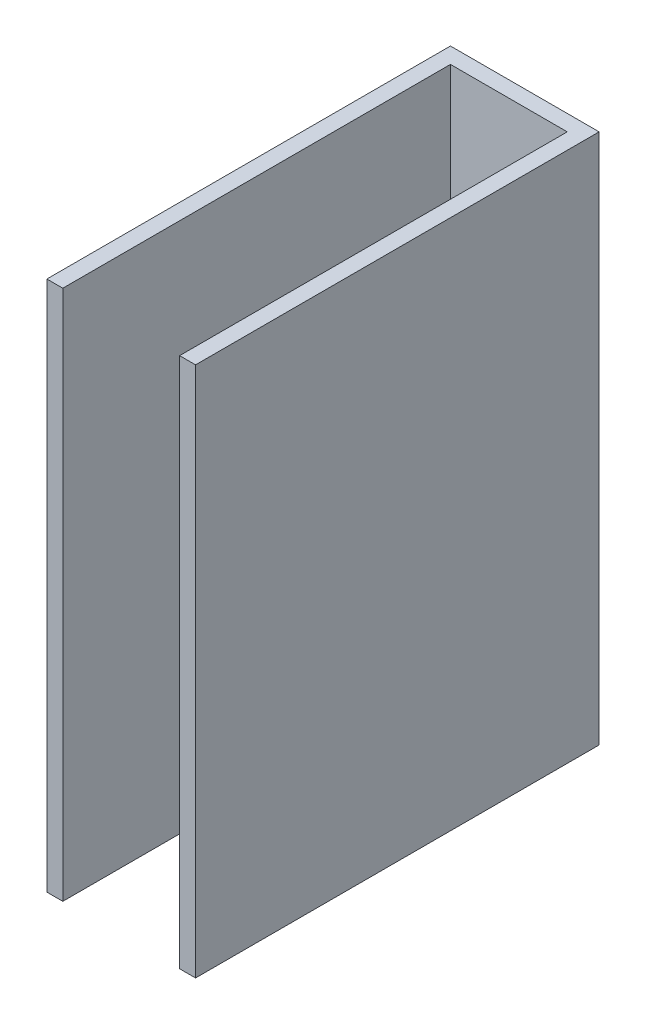
ISO-10303-21;
HEADER;
FILE_DESCRIPTION(('STEP AP214'),'2;1');
FILE_NAME('part.step','',(''),(''),'','','');
FILE_SCHEMA(('AUTOMOTIVE_DESIGN { 1 0 10303 214 1 1 1 1 }'));
ENDSEC;
DATA;
#1=APPLICATION_CONTEXT('core data for automotive mechanical design processes');
#2=APPLICATION_PROTOCOL_DEFINITION('international standard','automotive_design',2000,#1);
#3=PRODUCT_CONTEXT('',#1,'mechanical');
#4=PRODUCT('Part','Part','',(#3));
#5=PRODUCT_RELATED_PRODUCT_CATEGORY('part','',(#4));
#6=PRODUCT_DEFINITION_FORMATION('','',#4);
#7=PRODUCT_DEFINITION_CONTEXT('part definition',#1,'design');
#8=PRODUCT_DEFINITION('design','',#6,#7);
#9=PRODUCT_DEFINITION_SHAPE('','',#8);
#10=(LENGTH_UNIT() NAMED_UNIT(*) SI_UNIT(.MILLI.,.METRE.));
#11=(NAMED_UNIT(*) PLANE_ANGLE_UNIT() SI_UNIT($,.RADIAN.));
#12=(NAMED_UNIT(*) SI_UNIT($,.STERADIAN.) SOLID_ANGLE_UNIT());
#13=UNCERTAINTY_MEASURE_WITH_UNIT(LENGTH_MEASURE(1.E-05),#10,'distance_accuracy_value','');
#14=(GEOMETRIC_REPRESENTATION_CONTEXT(3) GLOBAL_UNCERTAINTY_ASSIGNED_CONTEXT((#13)) GLOBAL_UNIT_ASSIGNED_CONTEXT((#10,
#11,#12)) REPRESENTATION_CONTEXT('',''));
#15=CARTESIAN_POINT('',(0.,0.,0.));
#16=DIRECTION('',(0.,0.,1.));
#17=DIRECTION('',(1.,0.,0.));
#18=AXIS2_PLACEMENT_3D('',#15,#16,#17);
#19=CARTESIAN_POINT('',(0.,100.,0.));
#20=DIRECTION('',(0.,0.,-1.));
#21=DIRECTION('',(-1.,0.,0.));
#22=AXIS2_PLACEMENT_3D('',#19,#20,#21);
#23=PLANE('',#22);
#24=DIRECTION('',(1.,0.,0.));
#25=VECTOR('',#24,1.);
#26=CARTESIAN_POINT('',(0.,0.,0.));
#27=LINE('',#26,#25);
#28=CARTESIAN_POINT('',(0.,0.,0.));
#29=VERTEX_POINT('',#28);
#30=CARTESIAN_POINT('',(22.,0.,0.));
#31=VERTEX_POINT('',#30);
#32=EDGE_CURVE('E130',#29,#31,#27,.T.);
#33=ORIENTED_EDGE('',*,*,#32,.T.);
#34=DIRECTION('',(0.,-1.,0.));
#35=VECTOR('',#34,1.);
#36=CARTESIAN_POINT('',(22.,100.,0.));
#37=LINE('',#36,#35);
#38=CARTESIAN_POINT('',(22.,100.,0.));
#39=VERTEX_POINT('',#38);
#40=EDGE_CURVE('E11',#39,#31,#37,.T.);
#41=ORIENTED_EDGE('',*,*,#40,.F.);
#42=DIRECTION('',(1.,0.,0.));
#43=VECTOR('',#42,1.);
#44=CARTESIAN_POINT('',(0.,100.,0.));
#45=LINE('',#44,#43);
#46=CARTESIAN_POINT('',(0.,100.,0.));
#47=VERTEX_POINT('',#46);
#48=EDGE_CURVE('E144',#47,#39,#45,.T.);
#49=ORIENTED_EDGE('',*,*,#48,.F.);
#50=DIRECTION('',(0.,-1.,0.));
#51=VECTOR('',#50,1.);
#52=CARTESIAN_POINT('',(0.,100.,0.));
#53=LINE('',#52,#51);
#54=EDGE_CURVE('E126',#47,#29,#53,.T.);
#55=ORIENTED_EDGE('',*,*,#54,.T.);
#56=EDGE_LOOP('',(#33,#41,#49,#55));
#57=FACE_BOUND('',#56,.T.);
#58=ADVANCED_FACE('F34',(#57),#23,.F.);
#59=CARTESIAN_POINT('',(22.,100.,0.));
#60=DIRECTION('',(1.,0.,0.));
#61=DIRECTION('',(0.,0.,-1.));
#62=AXIS2_PLACEMENT_3D('',#59,#60,#61);
#63=PLANE('',#62);
#64=DIRECTION('',(0.,0.,1.));
#65=VECTOR('',#64,1.);
#66=CARTESIAN_POINT('',(22.,0.,0.));
#67=LINE('',#66,#65);
#68=CARTESIAN_POINT('',(22.,0.,73.));
#69=VERTEX_POINT('',#68);
#70=EDGE_CURVE('E133',#31,#69,#67,.T.);
#71=ORIENTED_EDGE('',*,*,#70,.T.);
#72=DIRECTION('',(0.,-1.,0.));
#73=VECTOR('',#72,1.);
#74=CARTESIAN_POINT('',(22.,100.,73.));
#75=LINE('',#74,#73);
#76=CARTESIAN_POINT('',(22.,100.,73.));
#77=VERTEX_POINT('',#76);
#78=EDGE_CURVE('E42',#77,#69,#75,.T.);
#79=ORIENTED_EDGE('',*,*,#78,.F.);
#80=DIRECTION('',(0.,0.,1.));
#81=VECTOR('',#80,1.);
#82=CARTESIAN_POINT('',(22.,100.,0.));
#83=LINE('',#82,#81);
#84=EDGE_CURVE('E93',#39,#77,#83,.T.);
#85=ORIENTED_EDGE('',*,*,#84,.F.);
#86=ORIENTED_EDGE('',*,*,#40,.T.);
#87=EDGE_LOOP('',(#71,#79,#85,#86));
#88=FACE_BOUND('',#87,.T.);
#89=ADVANCED_FACE('F179',(#88),#63,.F.);
#90=CARTESIAN_POINT('',(25.,100.,73.));
#91=DIRECTION('',(0.,0.,-1.));
#92=DIRECTION('',(-1.,0.,0.));
#93=AXIS2_PLACEMENT_3D('',#90,#91,#92);
#94=PLANE('',#93);
#95=DIRECTION('',(1.,0.,0.));
#96=VECTOR('',#95,1.);
#97=CARTESIAN_POINT('',(25.,0.,73.));
#98=LINE('',#97,#96);
#99=CARTESIAN_POINT('',(25.,0.,73.));
#100=VERTEX_POINT('',#99);
#101=EDGE_CURVE('E135',#69,#100,#98,.T.);
#102=ORIENTED_EDGE('',*,*,#101,.T.);
#103=DIRECTION('',(0.,-1.,0.));
#104=VECTOR('',#103,1.);
#105=CARTESIAN_POINT('',(25.,100.,73.));
#106=LINE('',#105,#104);
#107=CARTESIAN_POINT('',(25.,100.,73.));
#108=VERTEX_POINT('',#107);
#109=EDGE_CURVE('E151',#108,#100,#106,.T.);
#110=ORIENTED_EDGE('',*,*,#109,.F.);
#111=DIRECTION('',(1.,0.,0.));
#112=VECTOR('',#111,1.);
#113=CARTESIAN_POINT('',(25.,100.,73.));
#114=LINE('',#113,#112);
#115=EDGE_CURVE('E159',#77,#108,#114,.T.);
#116=ORIENTED_EDGE('',*,*,#115,.F.);
#117=ORIENTED_EDGE('',*,*,#78,.T.);
#118=EDGE_LOOP('',(#102,#110,#116,#117));
#119=FACE_BOUND('',#118,.T.);
#120=ADVANCED_FACE('F157',(#119),#94,.F.);
#121=CARTESIAN_POINT('',(25.,100.,-3.));
#122=DIRECTION('',(-1.,0.,0.));
#123=DIRECTION('',(0.,0.,1.));
#124=AXIS2_PLACEMENT_3D('',#121,#122,#123);
#125=PLANE('',#124);
#126=DIRECTION('',(0.,0.,-1.));
#127=VECTOR('',#126,1.);
#128=CARTESIAN_POINT('',(25.,0.,-3.));
#129=LINE('',#128,#127);
#130=CARTESIAN_POINT('',(25.,0.,-3.));
#131=VERTEX_POINT('',#130);
#132=EDGE_CURVE('E137',#100,#131,#129,.T.);
#133=ORIENTED_EDGE('',*,*,#132,.T.);
#134=DIRECTION('',(0.,-1.,0.));
#135=VECTOR('',#134,1.);
#136=CARTESIAN_POINT('',(25.,100.,-3.));
#137=LINE('',#136,#135);
#138=CARTESIAN_POINT('',(25.,100.,-3.));
#139=VERTEX_POINT('',#138);
#140=EDGE_CURVE('E148',#139,#131,#137,.T.);
#141=ORIENTED_EDGE('',*,*,#140,.F.);
#142=DIRECTION('',(0.,0.,-1.));
#143=VECTOR('',#142,1.);
#144=CARTESIAN_POINT('',(25.,100.,-3.));
#145=LINE('',#144,#143);
#146=EDGE_CURVE('E171',#108,#139,#145,.T.);
#147=ORIENTED_EDGE('',*,*,#146,.F.);
#148=ORIENTED_EDGE('',*,*,#109,.T.);
#149=EDGE_LOOP('',(#133,#141,#147,#148));
#150=FACE_BOUND('',#149,.T.);
#151=ADVANCED_FACE('F167',(#150),#125,.F.);
#152=CARTESIAN_POINT('',(-3.,100.,-3.));
#153=DIRECTION('',(0.,0.,1.));
#154=DIRECTION('',(1.,0.,0.));
#155=AXIS2_PLACEMENT_3D('',#152,#153,#154);
#156=PLANE('',#155);
#157=DIRECTION('',(-1.,0.,0.));
#158=VECTOR('',#157,1.);
#159=CARTESIAN_POINT('',(-3.,0.,-3.));
#160=LINE('',#159,#158);
#161=CARTESIAN_POINT('',(-3.,0.,-3.));
#162=VERTEX_POINT('',#161);
#163=EDGE_CURVE('E139',#131,#162,#160,.T.);
#164=ORIENTED_EDGE('',*,*,#163,.T.);
#165=DIRECTION('',(0.,-1.,0.));
#166=VECTOR('',#165,1.);
#167=CARTESIAN_POINT('',(-3.,100.,-3.));
#168=LINE('',#167,#166);
#169=CARTESIAN_POINT('',(-3.,100.,-3.));
#170=VERTEX_POINT('',#169);
#171=EDGE_CURVE('E121',#170,#162,#168,.T.);
#172=ORIENTED_EDGE('',*,*,#171,.F.);
#173=DIRECTION('',(-1.,0.,0.));
#174=VECTOR('',#173,1.);
#175=CARTESIAN_POINT('',(-3.,100.,-3.));
#176=LINE('',#175,#174);
#177=EDGE_CURVE('E112',#139,#170,#176,.T.);
#178=ORIENTED_EDGE('',*,*,#177,.F.);
#179=ORIENTED_EDGE('',*,*,#140,.T.);
#180=EDGE_LOOP('',(#164,#172,#178,#179));
#181=FACE_BOUND('',#180,.T.);
#182=ADVANCED_FACE('F170',(#181),#156,.F.);
#183=CARTESIAN_POINT('',(-2.99999999999999,100.,73.));
#184=DIRECTION('',(1.,0.,0.));
#185=DIRECTION('',(0.,0.,-1.));
#186=AXIS2_PLACEMENT_3D('',#183,#184,#185);
#187=PLANE('',#186);
#188=DIRECTION('',(0.,0.,1.));
#189=VECTOR('',#188,1.);
#190=CARTESIAN_POINT('',(-2.99999999999999,0.,73.));
#191=LINE('',#190,#189);
#192=CARTESIAN_POINT('',(-2.99999999999999,0.,73.));
#193=VERTEX_POINT('',#192);
#194=EDGE_CURVE('E120',#162,#193,#191,.T.);
#195=ORIENTED_EDGE('',*,*,#194,.T.);
#196=DIRECTION('',(0.,-1.,0.));
#197=VECTOR('',#196,1.);
#198=CARTESIAN_POINT('',(-2.99999999999999,100.,73.));
#199=LINE('',#198,#197);
#200=CARTESIAN_POINT('',(-2.99999999999999,100.,73.));
#201=VERTEX_POINT('',#200);
#202=EDGE_CURVE('E117',#201,#193,#199,.T.);
#203=ORIENTED_EDGE('',*,*,#202,.F.);
#204=DIRECTION('',(0.,0.,1.));
#205=VECTOR('',#204,1.);
#206=CARTESIAN_POINT('',(-2.99999999999999,100.,73.));
#207=LINE('',#206,#205);
#208=EDGE_CURVE('E106',#170,#201,#207,.T.);
#209=ORIENTED_EDGE('',*,*,#208,.F.);
#210=ORIENTED_EDGE('',*,*,#171,.T.);
#211=EDGE_LOOP('',(#195,#203,#209,#210));
#212=FACE_BOUND('',#211,.T.);
#213=ADVANCED_FACE('F118',(#212),#187,.F.);
#214=CARTESIAN_POINT('',(0.,100.,73.));
#215=DIRECTION('',(0.,0.,-1.));
#216=DIRECTION('',(-1.,0.,0.));
#217=AXIS2_PLACEMENT_3D('',#214,#215,#216);
#218=PLANE('',#217);
#219=DIRECTION('',(1.,0.,0.));
#220=VECTOR('',#219,1.);
#221=CARTESIAN_POINT('',(0.,0.,73.));
#222=LINE('',#221,#220);
#223=CARTESIAN_POINT('',(0.,0.,73.));
#224=VERTEX_POINT('',#223);
#225=EDGE_CURVE('E79',#193,#224,#222,.T.);
#226=ORIENTED_EDGE('',*,*,#225,.T.);
#227=DIRECTION('',(0.,-1.,0.));
#228=VECTOR('',#227,1.);
#229=CARTESIAN_POINT('',(0.,100.,73.));
#230=LINE('',#229,#228);
#231=CARTESIAN_POINT('',(0.,100.,73.));
#232=VERTEX_POINT('',#231);
#233=EDGE_CURVE('E122',#232,#224,#230,.T.);
#234=ORIENTED_EDGE('',*,*,#233,.F.);
#235=DIRECTION('',(1.,0.,0.));
#236=VECTOR('',#235,1.);
#237=CARTESIAN_POINT('',(0.,100.,73.));
#238=LINE('',#237,#236);
#239=EDGE_CURVE('E110',#201,#232,#238,.T.);
#240=ORIENTED_EDGE('',*,*,#239,.F.);
#241=ORIENTED_EDGE('',*,*,#202,.T.);
#242=EDGE_LOOP('',(#226,#234,#240,#241));
#243=FACE_BOUND('',#242,.T.);
#244=ADVANCED_FACE('F124',(#243),#218,.F.);
#245=CARTESIAN_POINT('',(0.,100.,0.));
#246=DIRECTION('',(-1.,0.,0.));
#247=DIRECTION('',(0.,0.,1.));
#248=AXIS2_PLACEMENT_3D('',#245,#246,#247);
#249=PLANE('',#248);
#250=DIRECTION('',(0.,0.,-1.));
#251=VECTOR('',#250,1.);
#252=CARTESIAN_POINT('',(0.,0.,0.));
#253=LINE('',#252,#251);
#254=EDGE_CURVE('E85',#224,#29,#253,.T.);
#255=ORIENTED_EDGE('',*,*,#254,.T.);
#256=ORIENTED_EDGE('',*,*,#54,.F.);
#257=DIRECTION('',(0.,0.,-1.));
#258=VECTOR('',#257,1.);
#259=CARTESIAN_POINT('',(0.,100.,0.));
#260=LINE('',#259,#258);
#261=EDGE_CURVE('E50',#232,#47,#260,.T.);
#262=ORIENTED_EDGE('',*,*,#261,.F.);
#263=ORIENTED_EDGE('',*,*,#233,.T.);
#264=EDGE_LOOP('',(#255,#256,#262,#263));
#265=FACE_BOUND('',#264,.T.);
#266=ADVANCED_FACE('F195',(#265),#249,.F.);
#267=CARTESIAN_POINT('',(0.,100.,0.));
#268=DIRECTION('',(0.,-1.,0.));
#269=DIRECTION('',(0.,0.,-1.));
#270=AXIS2_PLACEMENT_3D('',#267,#268,#269);
#271=PLANE('',#270);
#272=ORIENTED_EDGE('',*,*,#48,.T.);
#273=ORIENTED_EDGE('',*,*,#84,.T.);
#274=ORIENTED_EDGE('',*,*,#115,.T.);
#275=ORIENTED_EDGE('',*,*,#146,.T.);
#276=ORIENTED_EDGE('',*,*,#177,.T.);
#277=ORIENTED_EDGE('',*,*,#208,.T.);
#278=ORIENTED_EDGE('',*,*,#239,.T.);
#279=ORIENTED_EDGE('',*,*,#261,.T.);
#280=EDGE_LOOP('',(#272,#273,#274,#275,#276,#277,#278,#279));
#281=FACE_BOUND('',#280,.T.);
#282=ADVANCED_FACE('F108',(#281),#271,.F.);
#283=CARTESIAN_POINT('',(0.,0.,0.));
#284=DIRECTION('',(0.,-1.,0.));
#285=DIRECTION('',(0.,0.,-1.));
#286=AXIS2_PLACEMENT_3D('',#283,#284,#285);
#287=PLANE('',#286);
#288=ORIENTED_EDGE('',*,*,#32,.F.);
#289=ORIENTED_EDGE('',*,*,#254,.F.);
#290=ORIENTED_EDGE('',*,*,#225,.F.);
#291=ORIENTED_EDGE('',*,*,#194,.F.);
#292=ORIENTED_EDGE('',*,*,#163,.F.);
#293=ORIENTED_EDGE('',*,*,#132,.F.);
#294=ORIENTED_EDGE('',*,*,#101,.F.);
#295=ORIENTED_EDGE('',*,*,#70,.F.);
#296=EDGE_LOOP('',(#288,#289,#290,#291,#292,#293,#294,#295));
#297=FACE_BOUND('',#296,.T.);
#298=ADVANCED_FACE('F163',(#297),#287,.T.);
#299=CLOSED_SHELL('',(#58,#89,#120,#151,#182,#213,#244,#266,#282,#298));
#300=MANIFOLD_SOLID_BREP('B2',#299);
#301=ADVANCED_BREP_SHAPE_REPRESENTATION('',(#18,#300),#14);
#302=SHAPE_DEFINITION_REPRESENTATION(#9,#301);
ENDSEC;
END-ISO-10303-21;
